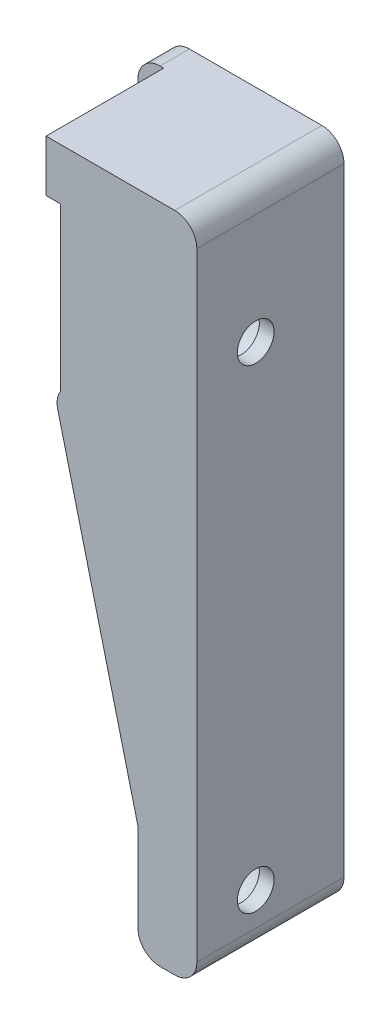
ISO-10303-21;
HEADER;
FILE_DESCRIPTION(('STEP AP214'),'2;1');
FILE_NAME('part.step','',(''),(''),'','','');
FILE_SCHEMA(('AUTOMOTIVE_DESIGN { 1 0 10303 214 1 1 1 1 }'));
ENDSEC;
DATA;
#1=APPLICATION_CONTEXT('core data for automotive mechanical design processes');
#2=APPLICATION_PROTOCOL_DEFINITION('international standard','automotive_design',2000,#1);
#3=PRODUCT_CONTEXT('',#1,'mechanical');
#4=PRODUCT('Part','Part','',(#3));
#5=PRODUCT_RELATED_PRODUCT_CATEGORY('part','',(#4));
#6=PRODUCT_DEFINITION_FORMATION('','',#4);
#7=PRODUCT_DEFINITION_CONTEXT('part definition',#1,'design');
#8=PRODUCT_DEFINITION('design','',#6,#7);
#9=PRODUCT_DEFINITION_SHAPE('','',#8);
#10=(LENGTH_UNIT() NAMED_UNIT(*) SI_UNIT(.MILLI.,.METRE.));
#11=(NAMED_UNIT(*) PLANE_ANGLE_UNIT() SI_UNIT($,.RADIAN.));
#12=(NAMED_UNIT(*) SI_UNIT($,.STERADIAN.) SOLID_ANGLE_UNIT());
#13=UNCERTAINTY_MEASURE_WITH_UNIT(LENGTH_MEASURE(1.E-05),#10,'distance_accuracy_value','');
#14=(GEOMETRIC_REPRESENTATION_CONTEXT(3) GLOBAL_UNCERTAINTY_ASSIGNED_CONTEXT((#13)) GLOBAL_UNIT_ASSIGNED_CONTEXT((#10,
#11,#12)) REPRESENTATION_CONTEXT('',''));
#15=CARTESIAN_POINT('',(0.,0.,0.));
#16=DIRECTION('',(0.,0.,1.));
#17=DIRECTION('',(1.,0.,0.));
#18=AXIS2_PLACEMENT_3D('',#15,#16,#17);
#19=CARTESIAN_POINT('',(0.,0.,-20.));
#20=DIRECTION('',(0.,0.,-1.));
#21=DIRECTION('',(-1.,0.,0.));
#22=AXIS2_PLACEMENT_3D('',#19,#20,#21);
#23=PLANE('',#22);
#24=CARTESIAN_POINT('',(44.,50.,-20.));
#25=DIRECTION('',(0.,0.,-1.));
#26=DIRECTION('',(-1.,0.,0.));
#27=AXIS2_PLACEMENT_3D('',#24,#25,#26);
#28=CIRCLE('',#27,20.);
#29=CARTESIAN_POINT('',(26.3529411764706,40.5882352941177,-20.));
#30=VERTEX_POINT('',#29);
#31=CARTESIAN_POINT('',(24.,50.,-20.));
#32=VERTEX_POINT('',#31);
#33=EDGE_CURVE('E173',#30,#32,#28,.T.);
#34=ORIENTED_EDGE('',*,*,#33,.T.);
#35=DIRECTION('',(0.,1.,0.));
#36=VECTOR('',#35,1.);
#37=CARTESIAN_POINT('',(24.,0.,-20.));
#38=LINE('',#37,#36);
#39=CARTESIAN_POINT('',(24.,87.,-20.));
#40=VERTEX_POINT('',#39);
#41=EDGE_CURVE('E159',#32,#40,#38,.T.);
#42=ORIENTED_EDGE('',*,*,#41,.T.);
#43=CARTESIAN_POINT('',(27.,87.,-20.));
#44=DIRECTION('',(0.,0.,-1.));
#45=DIRECTION('',(-1.,0.,0.));
#46=AXIS2_PLACEMENT_3D('',#43,#44,#45);
#47=CIRCLE('',#46,3.);
#48=CARTESIAN_POINT('',(27.,90.,-20.));
#49=VERTEX_POINT('',#48);
#50=EDGE_CURVE('E170',#40,#49,#47,.T.);
#51=ORIENTED_EDGE('',*,*,#50,.T.);
#52=DIRECTION('',(1.,0.,0.));
#53=VECTOR('',#52,1.);
#54=CARTESIAN_POINT('',(48.,90.,-20.));
#55=LINE('',#54,#53);
#56=CARTESIAN_POINT('',(45.,90.,-20.));
#57=VERTEX_POINT('',#56);
#58=EDGE_CURVE('E250',#49,#57,#55,.T.);
#59=ORIENTED_EDGE('',*,*,#58,.T.);
#60=CARTESIAN_POINT('',(45.,87.,-20.));
#61=DIRECTION('',(0.,0.,-1.));
#62=DIRECTION('',(-1.,0.,0.));
#63=AXIS2_PLACEMENT_3D('',#60,#61,#62);
#64=CIRCLE('',#63,3.);
#65=CARTESIAN_POINT('',(48.,87.,-20.));
#66=VERTEX_POINT('',#65);
#67=EDGE_CURVE('E181',#57,#66,#64,.T.);
#68=ORIENTED_EDGE('',*,*,#67,.T.);
#69=DIRECTION('',(0.,-1.,0.));
#70=VECTOR('',#69,1.);
#71=CARTESIAN_POINT('',(48.,0.,-20.));
#72=LINE('',#71,#70);
#73=CARTESIAN_POINT('',(48.,3.,-20.));
#74=VERTEX_POINT('',#73);
#75=EDGE_CURVE('E241',#66,#74,#72,.T.);
#76=ORIENTED_EDGE('',*,*,#75,.T.);
#77=CARTESIAN_POINT('',(45.,3.,-20.));
#78=DIRECTION('',(0.,0.,-1.));
#79=DIRECTION('',(-1.,0.,0.));
#80=AXIS2_PLACEMENT_3D('',#77,#78,#79);
#81=CIRCLE('',#80,3.);
#82=CARTESIAN_POINT('',(45.,0.,-20.));
#83=VERTEX_POINT('',#82);
#84=EDGE_CURVE('E182',#74,#83,#81,.T.);
#85=ORIENTED_EDGE('',*,*,#84,.T.);
#86=DIRECTION('',(-1.,0.,0.));
#87=VECTOR('',#86,1.);
#88=CARTESIAN_POINT('',(48.,0.,-20.));
#89=LINE('',#88,#87);
#90=CARTESIAN_POINT('',(43.,0.,-20.));
#91=VERTEX_POINT('',#90);
#92=EDGE_CURVE('E237',#83,#91,#89,.T.);
#93=ORIENTED_EDGE('',*,*,#92,.T.);
#94=CARTESIAN_POINT('',(43.,3.,-20.));
#95=DIRECTION('',(0.,0.,-1.));
#96=DIRECTION('',(-1.,0.,0.));
#97=AXIS2_PLACEMENT_3D('',#94,#95,#96);
#98=CIRCLE('',#97,3.);
#99=CARTESIAN_POINT('',(40.,3.,-20.));
#100=VERTEX_POINT('',#99);
#101=EDGE_CURVE('E60',#91,#100,#98,.T.);
#102=ORIENTED_EDGE('',*,*,#101,.T.);
#103=DIRECTION('',(0.,1.,0.));
#104=VECTOR('',#103,1.);
#105=CARTESIAN_POINT('',(40.,15.,-20.));
#106=LINE('',#105,#104);
#107=CARTESIAN_POINT('',(40.,15.,-20.));
#108=VERTEX_POINT('',#107);
#109=EDGE_CURVE('E201',#100,#108,#106,.T.);
#110=ORIENTED_EDGE('',*,*,#109,.T.);
#111=DIRECTION('',(-0.470588235294118,0.882352941176471,0.));
#112=VECTOR('',#111,1.);
#113=CARTESIAN_POINT('',(24.,45.,-20.));
#114=LINE('',#113,#112);
#115=EDGE_CURVE('E297',#108,#30,#114,.T.);
#116=ORIENTED_EDGE('',*,*,#115,.T.);
#117=EDGE_LOOP('',(#34,#42,#51,#59,#68,#76,#85,#93,#102,#110,#116));
#118=FACE_BOUND('',#117,.T.);
#119=ADVANCED_FACE('F37',(#118),#23,.T.);
#120=CARTESIAN_POINT('',(0.,0.,-16.));
#121=DIRECTION('',(0.,0.,1.));
#122=DIRECTION('',(1.,0.,0.));
#123=AXIS2_PLACEMENT_3D('',#120,#121,#122);
#124=PLANE('',#123);
#125=CARTESIAN_POINT('',(27.,87.,-16.));
#126=DIRECTION('',(0.,0.,1.));
#127=DIRECTION('',(1.,0.,0.));
#128=AXIS2_PLACEMENT_3D('',#125,#126,#127);
#129=CIRCLE('',#128,3.);
#130=CARTESIAN_POINT('',(27.,90.,-16.));
#131=VERTEX_POINT('',#130);
#132=CARTESIAN_POINT('',(24.,87.,-16.));
#133=VERTEX_POINT('',#132);
#134=EDGE_CURVE('E184',#131,#133,#129,.T.);
#135=ORIENTED_EDGE('',*,*,#134,.T.);
#136=DIRECTION('',(0.,-1.,0.));
#137=VECTOR('',#136,1.);
#138=CARTESIAN_POINT('',(24.,0.,-16.));
#139=LINE('',#138,#137);
#140=CARTESIAN_POINT('',(24.,50.,-16.));
#141=VERTEX_POINT('',#140);
#142=EDGE_CURVE('E162',#133,#141,#139,.T.);
#143=ORIENTED_EDGE('',*,*,#142,.T.);
#144=CARTESIAN_POINT('',(44.,50.,-16.));
#145=DIRECTION('',(0.,0.,1.));
#146=DIRECTION('',(1.,0.,0.));
#147=AXIS2_PLACEMENT_3D('',#144,#145,#146);
#148=CIRCLE('',#147,20.);
#149=CARTESIAN_POINT('',(26.3529411764706,40.5882352941177,-16.));
#150=VERTEX_POINT('',#149);
#151=EDGE_CURVE('E222',#141,#150,#148,.T.);
#152=ORIENTED_EDGE('',*,*,#151,.T.);
#153=DIRECTION('',(0.470588235294118,-0.882352941176471,0.));
#154=VECTOR('',#153,1.);
#155=CARTESIAN_POINT('',(37.3702422145329,19.9307958477509,-16.));
#156=LINE('',#155,#154);
#157=CARTESIAN_POINT('',(40.,15.,-16.));
#158=VERTEX_POINT('',#157);
#159=EDGE_CURVE('E282',#150,#158,#156,.T.);
#160=ORIENTED_EDGE('',*,*,#159,.T.);
#161=DIRECTION('',(0.242535625036333,-0.970142500145332,0.));
#162=VECTOR('',#161,1.);
#163=CARTESIAN_POINT('',(28.5,61.,-16.));
#164=LINE('',#163,#162);
#165=CARTESIAN_POINT('',(29.0945845895366,58.6216616418535,-16.));
#166=VERTEX_POINT('',#165);
#167=EDGE_CURVE('E270',#166,#158,#164,.T.);
#168=ORIENTED_EDGE('',*,*,#167,.F.);
#169=CARTESIAN_POINT('',(32.0050120899726,59.3492685169625,-16.));
#170=DIRECTION('',(0.,0.,1.));
#171=DIRECTION('',(1.,0.,0.));
#172=AXIS2_PLACEMENT_3D('',#169,#170,#171);
#173=CIRCLE('',#172,3.);
#174=CARTESIAN_POINT('',(29.5,61.,-16.));
#175=VERTEX_POINT('',#174);
#176=EDGE_CURVE('E11',#166,#175,#173,.F.);
#177=ORIENTED_EDGE('',*,*,#176,.T.);
#178=DIRECTION('',(0.,-1.,0.));
#179=VECTOR('',#178,1.);
#180=CARTESIAN_POINT('',(29.5,83.,-16.));
#181=LINE('',#180,#179);
#182=CARTESIAN_POINT('',(29.5,83.,-16.));
#183=VERTEX_POINT('',#182);
#184=EDGE_CURVE('E288',#183,#175,#181,.T.);
#185=ORIENTED_EDGE('',*,*,#184,.F.);
#186=DIRECTION('',(1.,0.,0.));
#187=VECTOR('',#186,1.);
#188=CARTESIAN_POINT('',(27.5,83.,-16.));
#189=LINE('',#188,#187);
#190=CARTESIAN_POINT('',(27.5,83.,-16.));
#191=VERTEX_POINT('',#190);
#192=EDGE_CURVE('E286',#191,#183,#189,.T.);
#193=ORIENTED_EDGE('',*,*,#192,.F.);
#194=DIRECTION('',(0.,-1.,0.));
#195=VECTOR('',#194,1.);
#196=CARTESIAN_POINT('',(27.5,83.,-16.));
#197=LINE('',#196,#195);
#198=CARTESIAN_POINT('',(27.5,90.,-16.));
#199=VERTEX_POINT('',#198);
#200=EDGE_CURVE('E284',#199,#191,#197,.T.);
#201=ORIENTED_EDGE('',*,*,#200,.F.);
#202=DIRECTION('',(1.,0.,0.));
#203=VECTOR('',#202,1.);
#204=CARTESIAN_POINT('',(27.5,90.,-16.));
#205=LINE('',#204,#203);
#206=EDGE_CURVE('E258',#131,#199,#205,.T.);
#207=ORIENTED_EDGE('',*,*,#206,.F.);
#208=EDGE_LOOP('',(#135,#143,#152,#160,#168,#177,#185,#193,#201,#207));
#209=FACE_BOUND('',#208,.T.);
#210=ADVANCED_FACE('F313',(#209),#124,.T.);
#211=CARTESIAN_POINT('',(48.,72.,-8.));
#212=DIRECTION('',(-1.,0.,0.));
#213=DIRECTION('',(0.,-1.,0.));
#214=AXIS2_PLACEMENT_3D('',#211,#212,#213);
#215=CYLINDRICAL_SURFACE('',#214,2.5);
#216=CARTESIAN_POINT('',(48.,72.,-8.));
#217=DIRECTION('',(1.,0.,0.));
#218=DIRECTION('',(0.,1.,0.));
#219=AXIS2_PLACEMENT_3D('',#216,#217,#218);
#220=CIRCLE('',#219,2.5);
#221=CARTESIAN_POINT('',(48.,74.5,-8.));
#222=VERTEX_POINT('',#221);
#223=EDGE_CURVE('E299',#222,#222,#220,.T.);
#224=ORIENTED_EDGE('',*,*,#223,.T.);
#225=EDGE_LOOP('',(#224));
#226=FACE_BOUND('',#225,.T.);
#227=CARTESIAN_POINT('',(46.,72.,-8.));
#228=DIRECTION('',(-1.,0.,0.));
#229=DIRECTION('',(0.,-1.,0.));
#230=AXIS2_PLACEMENT_3D('',#227,#228,#229);
#231=CIRCLE('',#230,2.5);
#232=CARTESIAN_POINT('',(46.,69.5,-8.));
#233=VERTEX_POINT('',#232);
#234=EDGE_CURVE('E229',#233,#233,#231,.T.);
#235=ORIENTED_EDGE('',*,*,#234,.T.);
#236=EDGE_LOOP('',(#235));
#237=FACE_BOUND('',#236,.T.);
#238=ADVANCED_FACE('F379',(#226,#237),#215,.F.);
#239=CARTESIAN_POINT('',(48.,7.5,-8.));
#240=DIRECTION('',(-1.,0.,0.));
#241=DIRECTION('',(0.,-1.,0.));
#242=AXIS2_PLACEMENT_3D('',#239,#240,#241);
#243=CYLINDRICAL_SURFACE('',#242,2.5);
#244=CARTESIAN_POINT('',(48.,7.5,-8.));
#245=DIRECTION('',(1.,0.,0.));
#246=DIRECTION('',(0.,1.,0.));
#247=AXIS2_PLACEMENT_3D('',#244,#245,#246);
#248=CIRCLE('',#247,2.5);
#249=CARTESIAN_POINT('',(48.,10.,-8.));
#250=VERTEX_POINT('',#249);
#251=EDGE_CURVE('E228',#250,#250,#248,.T.);
#252=ORIENTED_EDGE('',*,*,#251,.T.);
#253=EDGE_LOOP('',(#252));
#254=FACE_BOUND('',#253,.T.);
#255=CARTESIAN_POINT('',(46.,7.5,-8.));
#256=DIRECTION('',(-1.,0.,0.));
#257=DIRECTION('',(0.,-1.,0.));
#258=AXIS2_PLACEMENT_3D('',#255,#256,#257);
#259=CIRCLE('',#258,2.5);
#260=CARTESIAN_POINT('',(46.,5.,-8.));
#261=VERTEX_POINT('',#260);
#262=EDGE_CURVE('E232',#261,#261,#259,.T.);
#263=ORIENTED_EDGE('',*,*,#262,.T.);
#264=EDGE_LOOP('',(#263));
#265=FACE_BOUND('',#264,.T.);
#266=ADVANCED_FACE('F372',(#254,#265),#243,.F.);
#267=CARTESIAN_POINT('',(48.,0.,-20.));
#268=DIRECTION('',(0.,1.,0.));
#269=DIRECTION('',(0.,0.,1.));
#270=AXIS2_PLACEMENT_3D('',#267,#268,#269);
#271=PLANE('',#270);
#272=ORIENTED_EDGE('',*,*,#92,.F.);
#273=DIRECTION('',(0.,0.,1.));
#274=VECTOR('',#273,1.);
#275=CARTESIAN_POINT('',(45.,0.,-20.));
#276=LINE('',#275,#274);
#277=CARTESIAN_POINT('',(45.,0.,0.));
#278=VERTEX_POINT('',#277);
#279=EDGE_CURVE('E192',#83,#278,#276,.T.);
#280=ORIENTED_EDGE('',*,*,#279,.T.);
#281=DIRECTION('',(-1.,0.,0.));
#282=VECTOR('',#281,1.);
#283=CARTESIAN_POINT('',(48.,0.,0.));
#284=LINE('',#283,#282);
#285=CARTESIAN_POINT('',(43.,0.,0.));
#286=VERTEX_POINT('',#285);
#287=EDGE_CURVE('E238',#278,#286,#284,.T.);
#288=ORIENTED_EDGE('',*,*,#287,.T.);
#289=DIRECTION('',(0.,0.,1.));
#290=VECTOR('',#289,1.);
#291=CARTESIAN_POINT('',(43.,0.,-20.));
#292=LINE('',#291,#290);
#293=EDGE_CURVE('E190',#286,#91,#292,.F.);
#294=ORIENTED_EDGE('',*,*,#293,.T.);
#295=EDGE_LOOP('',(#272,#280,#288,#294));
#296=FACE_BOUND('',#295,.T.);
#297=ADVANCED_FACE('F370',(#296),#271,.F.);
#298=CARTESIAN_POINT('',(48.,90.,-20.));
#299=DIRECTION('',(0.,-1.,0.));
#300=DIRECTION('',(0.,0.,-1.));
#301=AXIS2_PLACEMENT_3D('',#298,#299,#300);
#302=PLANE('',#301);
#303=DIRECTION('',(1.,0.,0.));
#304=VECTOR('',#303,1.);
#305=CARTESIAN_POINT('',(48.,90.,0.));
#306=LINE('',#305,#304);
#307=CARTESIAN_POINT('',(27.5,90.,0.));
#308=VERTEX_POINT('',#307);
#309=CARTESIAN_POINT('',(45.,90.,0.));
#310=VERTEX_POINT('',#309);
#311=EDGE_CURVE('E242',#308,#310,#306,.T.);
#312=ORIENTED_EDGE('',*,*,#311,.T.);
#313=DIRECTION('',(0.,0.,1.));
#314=VECTOR('',#313,1.);
#315=CARTESIAN_POINT('',(45.,90.,-20.));
#316=LINE('',#315,#314);
#317=EDGE_CURVE('E203',#310,#57,#316,.F.);
#318=ORIENTED_EDGE('',*,*,#317,.T.);
#319=ORIENTED_EDGE('',*,*,#58,.F.);
#320=DIRECTION('',(0.,0.,1.));
#321=VECTOR('',#320,1.);
#322=CARTESIAN_POINT('',(27.,90.,-20.));
#323=LINE('',#322,#321);
#324=EDGE_CURVE('E180',#49,#131,#323,.T.);
#325=ORIENTED_EDGE('',*,*,#324,.T.);
#326=ORIENTED_EDGE('',*,*,#206,.T.);
#327=DIRECTION('',(0.,0.,1.));
#328=VECTOR('',#327,1.);
#329=CARTESIAN_POINT('',(27.5,90.,-16.));
#330=LINE('',#329,#328);
#331=EDGE_CURVE('E262',#199,#308,#330,.T.);
#332=ORIENTED_EDGE('',*,*,#331,.T.);
#333=EDGE_LOOP('',(#312,#318,#319,#325,#326,#332));
#334=FACE_BOUND('',#333,.T.);
#335=ADVANCED_FACE('F352',(#334),#302,.F.);
#336=CARTESIAN_POINT('',(48.,0.,0.));
#337=DIRECTION('',(0.,0.,-1.));
#338=DIRECTION('',(1.,0.,0.));
#339=AXIS2_PLACEMENT_3D('',#336,#337,#338);
#340=PLANE('',#339);
#341=DIRECTION('',(0.,-1.,0.));
#342=VECTOR('',#341,1.);
#343=CARTESIAN_POINT('',(29.5,83.,0.));
#344=LINE('',#343,#342);
#345=CARTESIAN_POINT('',(29.5,83.,0.));
#346=VERTEX_POINT('',#345);
#347=CARTESIAN_POINT('',(29.5,61.,0.));
#348=VERTEX_POINT('',#347);
#349=EDGE_CURVE('E277',#346,#348,#344,.T.);
#350=ORIENTED_EDGE('',*,*,#349,.T.);
#351=CARTESIAN_POINT('',(32.0050120899726,59.3492685169625,0.));
#352=DIRECTION('',(0.,0.,-1.));
#353=DIRECTION('',(-1.,0.,0.));
#354=AXIS2_PLACEMENT_3D('',#351,#352,#353);
#355=CIRCLE('',#354,3.);
#356=CARTESIAN_POINT('',(29.0945845895366,58.6216616418535,0.));
#357=VERTEX_POINT('',#356);
#358=EDGE_CURVE('E214',#348,#357,#355,.F.);
#359=ORIENTED_EDGE('',*,*,#358,.T.);
#360=DIRECTION('',(0.242535625036333,-0.970142500145332,0.));
#361=VECTOR('',#360,1.);
#362=CARTESIAN_POINT('',(28.5,61.,0.));
#363=LINE('',#362,#361);
#364=CARTESIAN_POINT('',(40.,15.,0.));
#365=VERTEX_POINT('',#364);
#366=EDGE_CURVE('E280',#357,#365,#363,.T.);
#367=ORIENTED_EDGE('',*,*,#366,.T.);
#368=DIRECTION('',(0.,-1.,0.));
#369=VECTOR('',#368,1.);
#370=CARTESIAN_POINT('',(40.,0.,0.));
#371=LINE('',#370,#369);
#372=CARTESIAN_POINT('',(40.,3.,0.));
#373=VERTEX_POINT('',#372);
#374=EDGE_CURVE('E267',#365,#373,#371,.T.);
#375=ORIENTED_EDGE('',*,*,#374,.T.);
#376=CARTESIAN_POINT('',(43.,3.,0.));
#377=DIRECTION('',(0.,0.,-1.));
#378=DIRECTION('',(-1.,0.,0.));
#379=AXIS2_PLACEMENT_3D('',#376,#377,#378);
#380=CIRCLE('',#379,3.);
#381=EDGE_CURVE('E220',#373,#286,#380,.F.);
#382=ORIENTED_EDGE('',*,*,#381,.T.);
#383=ORIENTED_EDGE('',*,*,#287,.F.);
#384=CARTESIAN_POINT('',(45.,3.,0.));
#385=DIRECTION('',(0.,0.,-1.));
#386=DIRECTION('',(-1.,0.,0.));
#387=AXIS2_PLACEMENT_3D('',#384,#385,#386);
#388=CIRCLE('',#387,3.);
#389=CARTESIAN_POINT('',(48.,3.,0.));
#390=VERTEX_POINT('',#389);
#391=EDGE_CURVE('E218',#278,#390,#388,.F.);
#392=ORIENTED_EDGE('',*,*,#391,.T.);
#393=DIRECTION('',(0.,-1.,0.));
#394=VECTOR('',#393,1.);
#395=CARTESIAN_POINT('',(48.,0.,0.));
#396=LINE('',#395,#394);
#397=CARTESIAN_POINT('',(48.,87.,0.));
#398=VERTEX_POINT('',#397);
#399=EDGE_CURVE('E245',#398,#390,#396,.T.);
#400=ORIENTED_EDGE('',*,*,#399,.F.);
#401=CARTESIAN_POINT('',(45.,87.,0.));
#402=DIRECTION('',(0.,0.,-1.));
#403=DIRECTION('',(-1.,0.,0.));
#404=AXIS2_PLACEMENT_3D('',#401,#402,#403);
#405=CIRCLE('',#404,3.);
#406=EDGE_CURVE('E216',#398,#310,#405,.F.);
#407=ORIENTED_EDGE('',*,*,#406,.T.);
#408=ORIENTED_EDGE('',*,*,#311,.F.);
#409=DIRECTION('',(0.,-1.,0.));
#410=VECTOR('',#409,1.);
#411=CARTESIAN_POINT('',(27.5,83.,0.));
#412=LINE('',#411,#410);
#413=CARTESIAN_POINT('',(27.5,83.,0.));
#414=VERTEX_POINT('',#413);
#415=EDGE_CURVE('E271',#308,#414,#412,.T.);
#416=ORIENTED_EDGE('',*,*,#415,.T.);
#417=DIRECTION('',(1.,0.,0.));
#418=VECTOR('',#417,1.);
#419=CARTESIAN_POINT('',(27.5,83.,0.));
#420=LINE('',#419,#418);
#421=EDGE_CURVE('E274',#414,#346,#420,.T.);
#422=ORIENTED_EDGE('',*,*,#421,.T.);
#423=EDGE_LOOP('',(#350,#359,#367,#375,#382,#383,#392,#400,#407,#408,#416,#422));
#424=FACE_BOUND('',#423,.T.);
#425=ADVANCED_FACE('F340',(#424),#340,.F.);
#426=CARTESIAN_POINT('',(48.,0.,-20.));
#427=DIRECTION('',(-1.,0.,0.));
#428=DIRECTION('',(0.,0.,1.));
#429=AXIS2_PLACEMENT_3D('',#426,#427,#428);
#430=PLANE('',#429);
#431=ORIENTED_EDGE('',*,*,#223,.F.);
#432=EDGE_LOOP('',(#431));
#433=FACE_BOUND('',#432,.T.);
#434=ORIENTED_EDGE('',*,*,#251,.F.);
#435=EDGE_LOOP('',(#434));
#436=FACE_BOUND('',#435,.T.);
#437=ORIENTED_EDGE('',*,*,#75,.F.);
#438=DIRECTION('',(0.,0.,1.));
#439=VECTOR('',#438,1.);
#440=CARTESIAN_POINT('',(48.,87.,-20.));
#441=LINE('',#440,#439);
#442=EDGE_CURVE('E207',#66,#398,#441,.T.);
#443=ORIENTED_EDGE('',*,*,#442,.T.);
#444=ORIENTED_EDGE('',*,*,#399,.T.);
#445=DIRECTION('',(0.,0.,1.));
#446=VECTOR('',#445,1.);
#447=CARTESIAN_POINT('',(48.,3.,-20.));
#448=LINE('',#447,#446);
#449=EDGE_CURVE('E210',#390,#74,#448,.F.);
#450=ORIENTED_EDGE('',*,*,#449,.T.);
#451=EDGE_LOOP('',(#437,#443,#444,#450));
#452=FACE_BOUND('',#451,.T.);
#453=ADVANCED_FACE('F361',(#433,#436,#452),#430,.F.);
#454=CARTESIAN_POINT('',(28.5,61.,-16.));
#455=DIRECTION('',(-0.970142500145332,-0.242535625036333,0.));
#456=DIRECTION('',(0.242535625036333,-0.970142500145332,0.));
#457=AXIS2_PLACEMENT_3D('',#454,#455,#456);
#458=PLANE('',#457);
#459=ORIENTED_EDGE('',*,*,#366,.F.);
#460=DIRECTION('',(0.,0.,-1.));
#461=VECTOR('',#460,1.);
#462=CARTESIAN_POINT('',(29.0945845895366,58.6216616418535,-16.));
#463=LINE('',#462,#461);
#464=EDGE_CURVE('E212',#357,#166,#463,.T.);
#465=ORIENTED_EDGE('',*,*,#464,.T.);
#466=ORIENTED_EDGE('',*,*,#167,.T.);
#467=DIRECTION('',(0.,0.,1.));
#468=VECTOR('',#467,1.);
#469=CARTESIAN_POINT('',(40.,15.,-16.));
#470=LINE('',#469,#468);
#471=EDGE_CURVE('E248',#158,#365,#470,.T.);
#472=ORIENTED_EDGE('',*,*,#471,.T.);
#473=EDGE_LOOP('',(#459,#465,#466,#472));
#474=FACE_BOUND('',#473,.T.);
#475=ADVANCED_FACE('F327',(#474),#458,.T.);
#476=CARTESIAN_POINT('',(40.,0.,-16.));
#477=DIRECTION('',(-1.,0.,0.));
#478=DIRECTION('',(0.,0.,1.));
#479=AXIS2_PLACEMENT_3D('',#476,#477,#478);
#480=PLANE('',#479);
#481=ORIENTED_EDGE('',*,*,#109,.F.);
#482=DIRECTION('',(0.,0.,1.));
#483=VECTOR('',#482,1.);
#484=CARTESIAN_POINT('',(40.,3.,0.));
#485=LINE('',#484,#483);
#486=CARTESIAN_POINT('',(40.,3.,-8.));
#487=VERTEX_POINT('',#486);
#488=EDGE_CURVE('E45',#100,#487,#485,.T.);
#489=ORIENTED_EDGE('',*,*,#488,.T.);
#490=CARTESIAN_POINT('',(40.,7.5,-8.));
#491=DIRECTION('',(-1.,0.,0.));
#492=DIRECTION('',(0.,0.,1.));
#493=AXIS2_PLACEMENT_3D('',#490,#491,#492);
#494=CIRCLE('',#493,4.5);
#495=EDGE_CURVE('E199',#487,#487,#494,.F.);
#496=ORIENTED_EDGE('',*,*,#495,.T.);
#497=DIRECTION('',(0.,0.,1.));
#498=VECTOR('',#497,1.);
#499=CARTESIAN_POINT('',(40.,3.,0.));
#500=LINE('',#499,#498);
#501=EDGE_CURVE('E52',#487,#373,#500,.T.);
#502=ORIENTED_EDGE('',*,*,#501,.T.);
#503=ORIENTED_EDGE('',*,*,#374,.F.);
#504=ORIENTED_EDGE('',*,*,#471,.F.);
#505=DIRECTION('',(0.,0.,-1.));
#506=VECTOR('',#505,1.);
#507=CARTESIAN_POINT('',(40.,15.,-10.));
#508=LINE('',#507,#506);
#509=EDGE_CURVE('E294',#158,#108,#508,.T.);
#510=ORIENTED_EDGE('',*,*,#509,.T.);
#511=EDGE_LOOP('',(#481,#489,#496,#502,#503,#504,#510));
#512=FACE_BOUND('',#511,.T.);
#513=ADVANCED_FACE('F197',(#512),#480,.T.);
#514=CARTESIAN_POINT('',(27.5,83.,-16.));
#515=DIRECTION('',(-1.,0.,0.));
#516=DIRECTION('',(0.,0.,1.));
#517=AXIS2_PLACEMENT_3D('',#514,#515,#516);
#518=PLANE('',#517);
#519=ORIENTED_EDGE('',*,*,#415,.F.);
#520=ORIENTED_EDGE('',*,*,#331,.F.);
#521=ORIENTED_EDGE('',*,*,#200,.T.);
#522=DIRECTION('',(0.,0.,1.));
#523=VECTOR('',#522,1.);
#524=CARTESIAN_POINT('',(27.5,83.,-16.));
#525=LINE('',#524,#523);
#526=EDGE_CURVE('E260',#191,#414,#525,.T.);
#527=ORIENTED_EDGE('',*,*,#526,.T.);
#528=EDGE_LOOP('',(#519,#520,#521,#527));
#529=FACE_BOUND('',#528,.T.);
#530=ADVANCED_FACE('F350',(#529),#518,.T.);
#531=CARTESIAN_POINT('',(27.5,83.,-16.));
#532=DIRECTION('',(0.,-1.,0.));
#533=DIRECTION('',(0.,0.,-1.));
#534=AXIS2_PLACEMENT_3D('',#531,#532,#533);
#535=PLANE('',#534);
#536=ORIENTED_EDGE('',*,*,#421,.F.);
#537=ORIENTED_EDGE('',*,*,#526,.F.);
#538=ORIENTED_EDGE('',*,*,#192,.T.);
#539=DIRECTION('',(0.,0.,1.));
#540=VECTOR('',#539,1.);
#541=CARTESIAN_POINT('',(29.5,83.,-16.));
#542=LINE('',#541,#540);
#543=EDGE_CURVE('E257',#183,#346,#542,.T.);
#544=ORIENTED_EDGE('',*,*,#543,.T.);
#545=EDGE_LOOP('',(#536,#537,#538,#544));
#546=FACE_BOUND('',#545,.T.);
#547=ADVANCED_FACE('F345',(#546),#535,.T.);
#548=CARTESIAN_POINT('',(29.5,83.,-16.));
#549=DIRECTION('',(-1.,0.,0.));
#550=DIRECTION('',(0.,-1.,0.));
#551=AXIS2_PLACEMENT_3D('',#548,#549,#550);
#552=PLANE('',#551);
#553=CARTESIAN_POINT('',(29.5,72.,-8.));
#554=DIRECTION('',(1.,0.,0.));
#555=DIRECTION('',(0.,1.,0.));
#556=AXIS2_PLACEMENT_3D('',#553,#554,#555);
#557=CIRCLE('',#556,4.50000000000001);
#558=CARTESIAN_POINT('',(29.5,76.5,-8.));
#559=VERTEX_POINT('',#558);
#560=EDGE_CURVE('E306',#559,#559,#557,.T.);
#561=ORIENTED_EDGE('',*,*,#560,.T.);
#562=EDGE_LOOP('',(#561));
#563=FACE_BOUND('',#562,.T.);
#564=ORIENTED_EDGE('',*,*,#349,.F.);
#565=ORIENTED_EDGE('',*,*,#543,.F.);
#566=ORIENTED_EDGE('',*,*,#184,.T.);
#567=DIRECTION('',(0.,0.,1.));
#568=VECTOR('',#567,1.);
#569=CARTESIAN_POINT('',(29.5,61.,-16.));
#570=LINE('',#569,#568);
#571=EDGE_CURVE('E254',#175,#348,#570,.T.);
#572=ORIENTED_EDGE('',*,*,#571,.T.);
#573=EDGE_LOOP('',(#564,#565,#566,#572));
#574=FACE_BOUND('',#573,.T.);
#575=ADVANCED_FACE('F337',(#563,#574),#552,.T.);
#576=CARTESIAN_POINT('',(24.,45.,-10.));
#577=DIRECTION('',(-0.882352941176471,-0.470588235294118,0.));
#578=DIRECTION('',(0.470588235294118,-0.882352941176471,0.));
#579=AXIS2_PLACEMENT_3D('',#576,#577,#578);
#580=PLANE('',#579);
#581=ORIENTED_EDGE('',*,*,#159,.F.);
#582=DIRECTION('',(0.,0.,-1.));
#583=VECTOR('',#582,1.);
#584=CARTESIAN_POINT('',(26.3529411764706,40.5882352941177,-20.));
#585=LINE('',#584,#583);
#586=EDGE_CURVE('E166',#150,#30,#585,.T.);
#587=ORIENTED_EDGE('',*,*,#586,.T.);
#588=ORIENTED_EDGE('',*,*,#115,.F.);
#589=ORIENTED_EDGE('',*,*,#509,.F.);
#590=EDGE_LOOP('',(#581,#587,#588,#589));
#591=FACE_BOUND('',#590,.T.);
#592=ADVANCED_FACE('F321',(#591),#580,.T.);
#593=CARTESIAN_POINT('',(46.,7.5,-8.));
#594=DIRECTION('',(-1.,0.,0.));
#595=DIRECTION('',(0.,-1.,0.));
#596=AXIS2_PLACEMENT_3D('',#593,#594,#595);
#597=CYLINDRICAL_SURFACE('',#596,4.5);
#598=ORIENTED_EDGE('',*,*,#495,.F.);
#599=EDGE_LOOP('',(#598));
#600=FACE_BOUND('',#599,.T.);
#601=CARTESIAN_POINT('',(46.,7.5,-8.));
#602=DIRECTION('',(1.,0.,0.));
#603=DIRECTION('',(0.,1.,0.));
#604=AXIS2_PLACEMENT_3D('',#601,#602,#603);
#605=CIRCLE('',#604,4.5);
#606=CARTESIAN_POINT('',(46.,12.,-8.));
#607=VERTEX_POINT('',#606);
#608=EDGE_CURVE('E175',#607,#607,#605,.T.);
#609=ORIENTED_EDGE('',*,*,#608,.T.);
#610=EDGE_LOOP('',(#609));
#611=FACE_BOUND('',#610,.T.);
#612=ADVANCED_FACE('F420',(#600,#611),#597,.F.);
#613=CARTESIAN_POINT('',(46.,7.5,-8.));
#614=DIRECTION('',(-1.,0.,0.));
#615=DIRECTION('',(0.,1.,0.));
#616=AXIS2_PLACEMENT_3D('',#613,#614,#615);
#617=PLANE('',#616);
#618=ORIENTED_EDGE('',*,*,#262,.F.);
#619=EDGE_LOOP('',(#618));
#620=FACE_BOUND('',#619,.T.);
#621=ORIENTED_EDGE('',*,*,#608,.F.);
#622=EDGE_LOOP('',(#621));
#623=FACE_BOUND('',#622,.T.);
#624=ADVANCED_FACE('F416',(#620,#623),#617,.T.);
#625=CARTESIAN_POINT('',(46.,72.,-8.));
#626=DIRECTION('',(-1.,0.,0.));
#627=DIRECTION('',(0.,-1.,0.));
#628=AXIS2_PLACEMENT_3D('',#625,#626,#627);
#629=CYLINDRICAL_SURFACE('',#628,4.50000000000001);
#630=CARTESIAN_POINT('',(46.,72.,-8.));
#631=DIRECTION('',(1.,0.,0.));
#632=DIRECTION('',(0.,1.,0.));
#633=AXIS2_PLACEMENT_3D('',#630,#631,#632);
#634=CIRCLE('',#633,4.50000000000001);
#635=CARTESIAN_POINT('',(46.,76.5,-8.));
#636=VERTEX_POINT('',#635);
#637=EDGE_CURVE('E234',#636,#636,#634,.T.);
#638=ORIENTED_EDGE('',*,*,#637,.T.);
#639=EDGE_LOOP('',(#638));
#640=FACE_BOUND('',#639,.T.);
#641=ORIENTED_EDGE('',*,*,#560,.F.);
#642=EDGE_LOOP('',(#641));
#643=FACE_BOUND('',#642,.T.);
#644=ADVANCED_FACE('F412',(#640,#643),#629,.F.);
#645=CARTESIAN_POINT('',(46.,72.,-8.));
#646=DIRECTION('',(-1.,0.,0.));
#647=DIRECTION('',(0.,1.,0.));
#648=AXIS2_PLACEMENT_3D('',#645,#646,#647);
#649=PLANE('',#648);
#650=ORIENTED_EDGE('',*,*,#234,.F.);
#651=EDGE_LOOP('',(#650));
#652=FACE_BOUND('',#651,.T.);
#653=ORIENTED_EDGE('',*,*,#637,.F.);
#654=EDGE_LOOP('',(#653));
#655=FACE_BOUND('',#654,.T.);
#656=ADVANCED_FACE('F393',(#652,#655),#649,.T.);
#657=CARTESIAN_POINT('',(44.,50.,-10.));
#658=DIRECTION('',(0.,0.,1.));
#659=DIRECTION('',(1.,0.,0.));
#660=AXIS2_PLACEMENT_3D('',#657,#658,#659);
#661=CYLINDRICAL_SURFACE('',#660,20.);
#662=ORIENTED_EDGE('',*,*,#151,.F.);
#663=DIRECTION('',(0.,0.,-1.));
#664=VECTOR('',#663,1.);
#665=CARTESIAN_POINT('',(24.,50.,-20.));
#666=LINE('',#665,#664);
#667=EDGE_CURVE('E167',#141,#32,#666,.T.);
#668=ORIENTED_EDGE('',*,*,#667,.T.);
#669=ORIENTED_EDGE('',*,*,#33,.F.);
#670=ORIENTED_EDGE('',*,*,#586,.F.);
#671=EDGE_LOOP('',(#662,#668,#669,#670));
#672=FACE_BOUND('',#671,.T.);
#673=ADVANCED_FACE('F318',(#672),#661,.T.);
#674=CARTESIAN_POINT('',(32.0050120899726,59.3492685169625,-16.));
#675=DIRECTION('',(0.,0.,1.));
#676=DIRECTION('',(1.,0.,0.));
#677=AXIS2_PLACEMENT_3D('',#674,#675,#676);
#678=CYLINDRICAL_SURFACE('',#677,3.);
#679=ORIENTED_EDGE('',*,*,#176,.F.);
#680=ORIENTED_EDGE('',*,*,#464,.F.);
#681=ORIENTED_EDGE('',*,*,#358,.F.);
#682=ORIENTED_EDGE('',*,*,#571,.F.);
#683=EDGE_LOOP('',(#679,#680,#681,#682));
#684=FACE_BOUND('',#683,.T.);
#685=ADVANCED_FACE('F334',(#684),#678,.T.);
#686=CARTESIAN_POINT('',(45.,87.,-20.));
#687=DIRECTION('',(0.,0.,1.));
#688=DIRECTION('',(1.,0.,0.));
#689=AXIS2_PLACEMENT_3D('',#686,#687,#688);
#690=CYLINDRICAL_SURFACE('',#689,3.);
#691=ORIENTED_EDGE('',*,*,#67,.F.);
#692=ORIENTED_EDGE('',*,*,#317,.F.);
#693=ORIENTED_EDGE('',*,*,#406,.F.);
#694=ORIENTED_EDGE('',*,*,#442,.F.);
#695=EDGE_LOOP('',(#691,#692,#693,#694));
#696=FACE_BOUND('',#695,.T.);
#697=ADVANCED_FACE('F358',(#696),#690,.T.);
#698=CARTESIAN_POINT('',(27.,87.,-20.));
#699=DIRECTION('',(0.,0.,1.));
#700=DIRECTION('',(1.,0.,0.));
#701=AXIS2_PLACEMENT_3D('',#698,#699,#700);
#702=CYLINDRICAL_SURFACE('',#701,3.);
#703=ORIENTED_EDGE('',*,*,#50,.F.);
#704=DIRECTION('',(0.,0.,1.));
#705=VECTOR('',#704,1.);
#706=CARTESIAN_POINT('',(24.,87.,-20.));
#707=LINE('',#706,#705);
#708=EDGE_CURVE('E156',#40,#133,#707,.T.);
#709=ORIENTED_EDGE('',*,*,#708,.T.);
#710=ORIENTED_EDGE('',*,*,#134,.F.);
#711=ORIENTED_EDGE('',*,*,#324,.F.);
#712=EDGE_LOOP('',(#703,#709,#710,#711));
#713=FACE_BOUND('',#712,.T.);
#714=ADVANCED_FACE('F178',(#713),#702,.T.);
#715=CARTESIAN_POINT('',(45.,3.,-20.));
#716=DIRECTION('',(0.,0.,1.));
#717=DIRECTION('',(1.,0.,0.));
#718=AXIS2_PLACEMENT_3D('',#715,#716,#717);
#719=CYLINDRICAL_SURFACE('',#718,3.);
#720=ORIENTED_EDGE('',*,*,#84,.F.);
#721=ORIENTED_EDGE('',*,*,#449,.F.);
#722=ORIENTED_EDGE('',*,*,#391,.F.);
#723=ORIENTED_EDGE('',*,*,#279,.F.);
#724=EDGE_LOOP('',(#720,#721,#722,#723));
#725=FACE_BOUND('',#724,.T.);
#726=ADVANCED_FACE('F367',(#725),#719,.T.);
#727=CARTESIAN_POINT('',(43.,3.,-16.));
#728=DIRECTION('',(0.,0.,-1.));
#729=DIRECTION('',(-1.,0.,0.));
#730=AXIS2_PLACEMENT_3D('',#727,#728,#729);
#731=CYLINDRICAL_SURFACE('',#730,3.);
#732=ORIENTED_EDGE('',*,*,#101,.F.);
#733=ORIENTED_EDGE('',*,*,#293,.F.);
#734=ORIENTED_EDGE('',*,*,#381,.F.);
#735=ORIENTED_EDGE('',*,*,#501,.F.);
#736=ORIENTED_EDGE('',*,*,#488,.F.);
#737=EDGE_LOOP('',(#732,#733,#734,#735,#736));
#738=FACE_BOUND('',#737,.T.);
#739=ADVANCED_FACE('F39',(#738),#731,.T.);
#740=CARTESIAN_POINT('',(24.,0.,0.));
#741=DIRECTION('',(-1.,0.,0.));
#742=DIRECTION('',(0.,0.,1.));
#743=AXIS2_PLACEMENT_3D('',#740,#741,#742);
#744=PLANE('',#743);
#745=ORIENTED_EDGE('',*,*,#142,.F.);
#746=ORIENTED_EDGE('',*,*,#708,.F.);
#747=ORIENTED_EDGE('',*,*,#41,.F.);
#748=ORIENTED_EDGE('',*,*,#667,.F.);
#749=EDGE_LOOP('',(#745,#746,#747,#748));
#750=FACE_BOUND('',#749,.T.);
#751=ADVANCED_FACE('F158',(#750),#744,.T.);
#752=CLOSED_SHELL('',(#119,#210,#238,#266,#297,#335,#425,#453,#475,#513,#530,#547,#575,#592,
#612,#624,#644,#656,#673,#685,#697,#714,#726,#739,#751));
#753=MANIFOLD_SOLID_BREP('B2',#752);
#754=ADVANCED_BREP_SHAPE_REPRESENTATION('',(#18,#753),#14);
#755=SHAPE_DEFINITION_REPRESENTATION(#9,#754);
ENDSEC;
END-ISO-10303-21;
